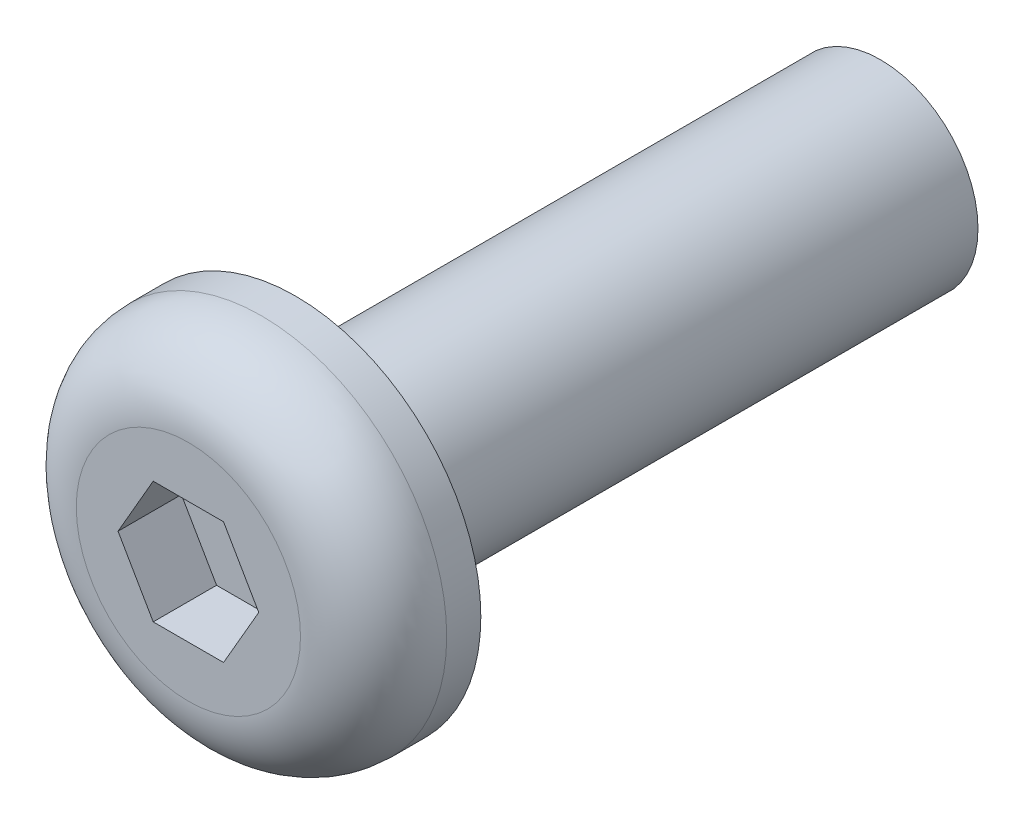
ISO-10303-21;
HEADER;
FILE_DESCRIPTION(('STEP AP214'),'2;1');
FILE_NAME('part.step','',(''),(''),'','','');
FILE_SCHEMA(('AUTOMOTIVE_DESIGN { 1 0 10303 214 1 1 1 1 }'));
ENDSEC;
DATA;
#1=APPLICATION_CONTEXT('core data for automotive mechanical design processes');
#2=APPLICATION_PROTOCOL_DEFINITION('international standard','automotive_design',2000,#1);
#3=PRODUCT_CONTEXT('',#1,'mechanical');
#4=PRODUCT('Part','Part','',(#3));
#5=PRODUCT_RELATED_PRODUCT_CATEGORY('part','',(#4));
#6=PRODUCT_DEFINITION_FORMATION('','',#4);
#7=PRODUCT_DEFINITION_CONTEXT('part definition',#1,'design');
#8=PRODUCT_DEFINITION('design','',#6,#7);
#9=PRODUCT_DEFINITION_SHAPE('','',#8);
#10=(LENGTH_UNIT() NAMED_UNIT(*) SI_UNIT(.MILLI.,.METRE.));
#11=(NAMED_UNIT(*) PLANE_ANGLE_UNIT() SI_UNIT($,.RADIAN.));
#12=(NAMED_UNIT(*) SI_UNIT($,.STERADIAN.) SOLID_ANGLE_UNIT());
#13=UNCERTAINTY_MEASURE_WITH_UNIT(LENGTH_MEASURE(1.E-05),#10,'distance_accuracy_value','');
#14=(GEOMETRIC_REPRESENTATION_CONTEXT(3) GLOBAL_UNCERTAINTY_ASSIGNED_CONTEXT((#13)) GLOBAL_UNIT_ASSIGNED_CONTEXT((#10,
#11,#12)) REPRESENTATION_CONTEXT('',''));
#15=CARTESIAN_POINT('',(0.,0.,0.));
#16=DIRECTION('',(0.,0.,1.));
#17=DIRECTION('',(1.,0.,0.));
#18=AXIS2_PLACEMENT_3D('',#15,#16,#17);
#19=CARTESIAN_POINT('',(0.,0.,14.2));
#20=DIRECTION('',(0.,0.,1.));
#21=DIRECTION('',(1.,0.,0.));
#22=AXIS2_PLACEMENT_3D('',#19,#20,#21);
#23=PLANE('',#22);
#24=CARTESIAN_POINT('',(0.,0.,14.2));
#25=DIRECTION('',(0.,0.,1.));
#26=DIRECTION('',(1.,0.,0.));
#27=AXIS2_PLACEMENT_3D('',#24,#25,#26);
#28=CIRCLE('',#27,2.3);
#29=CARTESIAN_POINT('',(2.3,0.,14.2));
#30=VERTEX_POINT('',#29);
#31=EDGE_CURVE('E47',#30,#30,#28,.T.);
#32=ORIENTED_EDGE('',*,*,#31,.T.);
#33=EDGE_LOOP('',(#32));
#34=FACE_BOUND('',#33,.T.);
#35=DIRECTION('',(-0.5,0.866025403784439,0.));
#36=VECTOR('',#35,1.);
#37=CARTESIAN_POINT('',(1.44337567297406,0.,14.2));
#38=LINE('',#37,#36);
#39=CARTESIAN_POINT('',(1.44337567297406,0.,14.2));
#40=VERTEX_POINT('',#39);
#41=CARTESIAN_POINT('',(0.721687836487032,1.25,14.2));
#42=VERTEX_POINT('',#41);
#43=EDGE_CURVE('E114',#40,#42,#38,.T.);
#44=ORIENTED_EDGE('',*,*,#43,.F.);
#45=DIRECTION('',(0.5,0.866025403784438,0.));
#46=VECTOR('',#45,1.);
#47=CARTESIAN_POINT('',(0.721687836487031,-1.25,14.2));
#48=LINE('',#47,#46);
#49=CARTESIAN_POINT('',(0.721687836487031,-1.25,14.2));
#50=VERTEX_POINT('',#49);
#51=EDGE_CURVE('E93',#50,#40,#48,.T.);
#52=ORIENTED_EDGE('',*,*,#51,.F.);
#53=DIRECTION('',(1.,0.,0.));
#54=VECTOR('',#53,1.);
#55=CARTESIAN_POINT('',(-0.721687836487033,-1.25,14.2));
#56=LINE('',#55,#54);
#57=CARTESIAN_POINT('',(-0.721687836487033,-1.25,14.2));
#58=VERTEX_POINT('',#57);
#59=EDGE_CURVE('E60',#58,#50,#56,.T.);
#60=ORIENTED_EDGE('',*,*,#59,.F.);
#61=DIRECTION('',(0.5,-0.866025403784439,0.));
#62=VECTOR('',#61,1.);
#63=CARTESIAN_POINT('',(-1.44337567297406,0.,14.2));
#64=LINE('',#63,#62);
#65=CARTESIAN_POINT('',(-1.44337567297406,0.,14.2));
#66=VERTEX_POINT('',#65);
#67=EDGE_CURVE('E124',#66,#58,#64,.T.);
#68=ORIENTED_EDGE('',*,*,#67,.F.);
#69=DIRECTION('',(-0.5,-0.866025403784439,0.));
#70=VECTOR('',#69,1.);
#71=CARTESIAN_POINT('',(-0.721687836487032,1.25,14.2));
#72=LINE('',#71,#70);
#73=CARTESIAN_POINT('',(-0.721687836487032,1.25,14.2));
#74=VERTEX_POINT('',#73);
#75=EDGE_CURVE('E113',#74,#66,#72,.T.);
#76=ORIENTED_EDGE('',*,*,#75,.F.);
#77=DIRECTION('',(-1.,0.,0.));
#78=VECTOR('',#77,1.);
#79=CARTESIAN_POINT('',(0.721687836487032,1.25,14.2));
#80=LINE('',#79,#78);
#81=EDGE_CURVE('E102',#42,#74,#80,.T.);
#82=ORIENTED_EDGE('',*,*,#81,.F.);
#83=EDGE_LOOP('',(#44,#52,#60,#68,#76,#82));
#84=FACE_BOUND('',#83,.T.);
#85=ADVANCED_FACE('F39',(#34,#84),#23,.T.);
#86=CARTESIAN_POINT('',(0.,0.,12.));
#87=DIRECTION('',(0.,0.,-1.));
#88=DIRECTION('',(-1.,0.,0.));
#89=AXIS2_PLACEMENT_3D('',#86,#87,#88);
#90=CYLINDRICAL_SURFACE('',#89,2.);
#91=CARTESIAN_POINT('',(0.,0.,12.));
#92=DIRECTION('',(0.,0.,1.));
#93=DIRECTION('',(1.,0.,0.));
#94=AXIS2_PLACEMENT_3D('',#91,#92,#93);
#95=CIRCLE('',#94,2.);
#96=CARTESIAN_POINT('',(2.,0.,12.));
#97=VERTEX_POINT('',#96);
#98=EDGE_CURVE('E151',#97,#97,#95,.T.);
#99=ORIENTED_EDGE('',*,*,#98,.F.);
#100=EDGE_LOOP('',(#99));
#101=FACE_BOUND('',#100,.T.);
#102=CARTESIAN_POINT('',(0.,0.,0.));
#103=DIRECTION('',(0.,0.,1.));
#104=DIRECTION('',(1.,0.,0.));
#105=AXIS2_PLACEMENT_3D('',#102,#103,#104);
#106=CIRCLE('',#105,2.);
#107=CARTESIAN_POINT('',(2.,0.,0.));
#108=VERTEX_POINT('',#107);
#109=EDGE_CURVE('E150',#108,#108,#106,.T.);
#110=ORIENTED_EDGE('',*,*,#109,.T.);
#111=EDGE_LOOP('',(#110));
#112=FACE_BOUND('',#111,.T.);
#113=ADVANCED_FACE('F175',(#101,#112),#90,.T.);
#114=CARTESIAN_POINT('',(0.,0.,0.));
#115=DIRECTION('',(0.,0.,1.));
#116=DIRECTION('',(1.,0.,0.));
#117=AXIS2_PLACEMENT_3D('',#114,#115,#116);
#118=PLANE('',#117);
#119=ORIENTED_EDGE('',*,*,#109,.F.);
#120=EDGE_LOOP('',(#119));
#121=FACE_BOUND('',#120,.T.);
#122=ADVANCED_FACE('F180',(#121),#118,.F.);
#123=CARTESIAN_POINT('',(0.,0.,14.2));
#124=DIRECTION('',(0.,0.,-1.));
#125=DIRECTION('',(-1.,0.,0.));
#126=AXIS2_PLACEMENT_3D('',#123,#124,#125);
#127=CYLINDRICAL_SURFACE('',#126,3.8);
#128=CARTESIAN_POINT('',(0.,0.,12.7));
#129=DIRECTION('',(0.,0.,1.));
#130=DIRECTION('',(1.,0.,0.));
#131=AXIS2_PLACEMENT_3D('',#128,#129,#130);
#132=CIRCLE('',#131,3.8);
#133=CARTESIAN_POINT('',(3.8,0.,12.7));
#134=VERTEX_POINT('',#133);
#135=EDGE_CURVE('E11',#134,#134,#132,.F.);
#136=ORIENTED_EDGE('',*,*,#135,.T.);
#137=EDGE_LOOP('',(#136));
#138=FACE_BOUND('',#137,.T.);
#139=CARTESIAN_POINT('',(0.,0.,12.));
#140=DIRECTION('',(0.,0.,1.));
#141=DIRECTION('',(1.,0.,0.));
#142=AXIS2_PLACEMENT_3D('',#139,#140,#141);
#143=CIRCLE('',#142,3.8);
#144=CARTESIAN_POINT('',(3.8,0.,12.));
#145=VERTEX_POINT('',#144);
#146=EDGE_CURVE('E147',#145,#145,#143,.T.);
#147=ORIENTED_EDGE('',*,*,#146,.T.);
#148=EDGE_LOOP('',(#147));
#149=FACE_BOUND('',#148,.T.);
#150=ADVANCED_FACE('F171',(#138,#149),#127,.T.);
#151=CARTESIAN_POINT('',(0.,0.,12.));
#152=DIRECTION('',(0.,0.,1.));
#153=DIRECTION('',(1.,0.,0.));
#154=AXIS2_PLACEMENT_3D('',#151,#152,#153);
#155=PLANE('',#154);
#156=ORIENTED_EDGE('',*,*,#98,.T.);
#157=EDGE_LOOP('',(#156));
#158=FACE_BOUND('',#157,.T.);
#159=ORIENTED_EDGE('',*,*,#146,.F.);
#160=EDGE_LOOP('',(#159));
#161=FACE_BOUND('',#160,.T.);
#162=ADVANCED_FACE('F161',(#158,#161),#155,.F.);
#163=CARTESIAN_POINT('',(0.,0.,12.7));
#164=DIRECTION('',(0.,0.,1.));
#165=DIRECTION('',(1.,0.,0.));
#166=AXIS2_PLACEMENT_3D('',#163,#164,#165);
#167=TOROIDAL_SURFACE('',#166,2.3,1.5);
#168=ORIENTED_EDGE('',*,*,#135,.F.);
#169=EDGE_LOOP('',(#168));
#170=FACE_BOUND('',#169,.T.);
#171=ORIENTED_EDGE('',*,*,#31,.F.);
#172=EDGE_LOOP('',(#171));
#173=FACE_BOUND('',#172,.T.);
#174=ADVANCED_FACE('F41',(#170,#173),#167,.T.);
#175=CARTESIAN_POINT('',(0.721687836487031,-1.25,14.2));
#176=DIRECTION('',(-0.866025403784438,0.5,0.));
#177=DIRECTION('',(-0.5,-0.866025403784438,0.));
#178=AXIS2_PLACEMENT_3D('',#175,#176,#177);
#179=PLANE('',#178);
#180=DIRECTION('',(0.5,0.866025403784438,0.));
#181=VECTOR('',#180,1.);
#182=CARTESIAN_POINT('',(0.721687836487031,-1.25,12.9));
#183=LINE('',#182,#181);
#184=CARTESIAN_POINT('',(0.721687836487031,-1.25,12.9));
#185=VERTEX_POINT('',#184);
#186=CARTESIAN_POINT('',(1.44337567297406,0.,12.9));
#187=VERTEX_POINT('',#186);
#188=EDGE_CURVE('E131',#185,#187,#183,.T.);
#189=ORIENTED_EDGE('',*,*,#188,.F.);
#190=DIRECTION('',(0.,0.,-1.));
#191=VECTOR('',#190,1.);
#192=CARTESIAN_POINT('',(0.721687836487031,-1.25,14.2));
#193=LINE('',#192,#191);
#194=EDGE_CURVE('E130',#50,#185,#193,.T.);
#195=ORIENTED_EDGE('',*,*,#194,.F.);
#196=ORIENTED_EDGE('',*,*,#51,.T.);
#197=DIRECTION('',(0.,0.,-1.));
#198=VECTOR('',#197,1.);
#199=CARTESIAN_POINT('',(1.44337567297406,0.,14.2));
#200=LINE('',#199,#198);
#201=EDGE_CURVE('E145',#40,#187,#200,.T.);
#202=ORIENTED_EDGE('',*,*,#201,.T.);
#203=EDGE_LOOP('',(#189,#195,#196,#202));
#204=FACE_BOUND('',#203,.T.);
#205=ADVANCED_FACE('F160',(#204),#179,.T.);
#206=CARTESIAN_POINT('',(1.44337567297406,0.,14.2));
#207=DIRECTION('',(-0.866025403784439,-0.5,0.));
#208=DIRECTION('',(0.5,-0.866025403784439,0.));
#209=AXIS2_PLACEMENT_3D('',#206,#207,#208);
#210=PLANE('',#209);
#211=DIRECTION('',(-0.5,0.866025403784439,0.));
#212=VECTOR('',#211,1.);
#213=CARTESIAN_POINT('',(1.44337567297406,0.,12.9));
#214=LINE('',#213,#212);
#215=CARTESIAN_POINT('',(0.721687836487032,1.25,12.9));
#216=VERTEX_POINT('',#215);
#217=EDGE_CURVE('E133',#187,#216,#214,.T.);
#218=ORIENTED_EDGE('',*,*,#217,.F.);
#219=ORIENTED_EDGE('',*,*,#201,.F.);
#220=ORIENTED_EDGE('',*,*,#43,.T.);
#221=DIRECTION('',(0.,0.,-1.));
#222=VECTOR('',#221,1.);
#223=CARTESIAN_POINT('',(0.721687836487032,1.25,14.2));
#224=LINE('',#223,#222);
#225=EDGE_CURVE('E109',#42,#216,#224,.T.);
#226=ORIENTED_EDGE('',*,*,#225,.T.);
#227=EDGE_LOOP('',(#218,#219,#220,#226));
#228=FACE_BOUND('',#227,.T.);
#229=ADVANCED_FACE('F168',(#228),#210,.T.);
#230=CARTESIAN_POINT('',(0.721687836487032,1.25,14.2));
#231=DIRECTION('',(0.,-1.,0.));
#232=DIRECTION('',(1.,0.,0.));
#233=AXIS2_PLACEMENT_3D('',#230,#231,#232);
#234=PLANE('',#233);
#235=DIRECTION('',(-1.,0.,0.));
#236=VECTOR('',#235,1.);
#237=CARTESIAN_POINT('',(0.721687836487032,1.25,12.9));
#238=LINE('',#237,#236);
#239=CARTESIAN_POINT('',(-0.721687836487032,1.25,12.9));
#240=VERTEX_POINT('',#239);
#241=EDGE_CURVE('E135',#216,#240,#238,.T.);
#242=ORIENTED_EDGE('',*,*,#241,.F.);
#243=ORIENTED_EDGE('',*,*,#225,.F.);
#244=ORIENTED_EDGE('',*,*,#81,.T.);
#245=DIRECTION('',(0.,0.,-1.));
#246=VECTOR('',#245,1.);
#247=CARTESIAN_POINT('',(-0.721687836487032,1.25,14.2));
#248=LINE('',#247,#246);
#249=EDGE_CURVE('E106',#74,#240,#248,.T.);
#250=ORIENTED_EDGE('',*,*,#249,.T.);
#251=EDGE_LOOP('',(#242,#243,#244,#250));
#252=FACE_BOUND('',#251,.T.);
#253=ADVANCED_FACE('F105',(#252),#234,.T.);
#254=CARTESIAN_POINT('',(-0.721687836487032,1.25,14.2));
#255=DIRECTION('',(0.866025403784439,-0.5,0.));
#256=DIRECTION('',(0.5,0.866025403784439,0.));
#257=AXIS2_PLACEMENT_3D('',#254,#255,#256);
#258=PLANE('',#257);
#259=DIRECTION('',(-0.5,-0.866025403784439,0.));
#260=VECTOR('',#259,1.);
#261=CARTESIAN_POINT('',(-0.721687836487032,1.25,12.9));
#262=LINE('',#261,#260);
#263=CARTESIAN_POINT('',(-1.44337567297406,0.,12.9));
#264=VERTEX_POINT('',#263);
#265=EDGE_CURVE('E120',#240,#264,#262,.T.);
#266=ORIENTED_EDGE('',*,*,#265,.F.);
#267=ORIENTED_EDGE('',*,*,#249,.F.);
#268=ORIENTED_EDGE('',*,*,#75,.T.);
#269=DIRECTION('',(0.,0.,-1.));
#270=VECTOR('',#269,1.);
#271=CARTESIAN_POINT('',(-1.44337567297406,0.,14.2));
#272=LINE('',#271,#270);
#273=EDGE_CURVE('E121',#66,#264,#272,.T.);
#274=ORIENTED_EDGE('',*,*,#273,.T.);
#275=EDGE_LOOP('',(#266,#267,#268,#274));
#276=FACE_BOUND('',#275,.T.);
#277=ADVANCED_FACE('F117',(#276),#258,.T.);
#278=CARTESIAN_POINT('',(-1.44337567297406,0.,14.2));
#279=DIRECTION('',(0.866025403784439,0.5,0.));
#280=DIRECTION('',(-0.5,0.866025403784439,0.));
#281=AXIS2_PLACEMENT_3D('',#278,#279,#280);
#282=PLANE('',#281);
#283=DIRECTION('',(0.5,-0.866025403784439,0.));
#284=VECTOR('',#283,1.);
#285=CARTESIAN_POINT('',(-1.44337567297406,0.,12.9));
#286=LINE('',#285,#284);
#287=CARTESIAN_POINT('',(-0.721687836487033,-1.25,12.9));
#288=VERTEX_POINT('',#287);
#289=EDGE_CURVE('E138',#264,#288,#286,.T.);
#290=ORIENTED_EDGE('',*,*,#289,.F.);
#291=ORIENTED_EDGE('',*,*,#273,.F.);
#292=ORIENTED_EDGE('',*,*,#67,.T.);
#293=DIRECTION('',(0.,0.,-1.));
#294=VECTOR('',#293,1.);
#295=CARTESIAN_POINT('',(-0.721687836487033,-1.25,14.2));
#296=LINE('',#295,#294);
#297=EDGE_CURVE('E54',#58,#288,#296,.T.);
#298=ORIENTED_EDGE('',*,*,#297,.T.);
#299=EDGE_LOOP('',(#290,#291,#292,#298));
#300=FACE_BOUND('',#299,.T.);
#301=ADVANCED_FACE('F243',(#300),#282,.T.);
#302=CARTESIAN_POINT('',(-0.721687836487033,-1.25,14.2));
#303=DIRECTION('',(0.,1.,0.));
#304=DIRECTION('',(-1.,0.,0.));
#305=AXIS2_PLACEMENT_3D('',#302,#303,#304);
#306=PLANE('',#305);
#307=DIRECTION('',(1.,0.,0.));
#308=VECTOR('',#307,1.);
#309=CARTESIAN_POINT('',(-0.721687836487033,-1.25,12.9));
#310=LINE('',#309,#308);
#311=EDGE_CURVE('E86',#288,#185,#310,.T.);
#312=ORIENTED_EDGE('',*,*,#311,.F.);
#313=ORIENTED_EDGE('',*,*,#297,.F.);
#314=ORIENTED_EDGE('',*,*,#59,.T.);
#315=ORIENTED_EDGE('',*,*,#194,.T.);
#316=EDGE_LOOP('',(#312,#313,#314,#315));
#317=FACE_BOUND('',#316,.T.);
#318=ADVANCED_FACE('F251',(#317),#306,.T.);
#319=CARTESIAN_POINT('',(0.,0.,12.9));
#320=DIRECTION('',(0.,0.,1.));
#321=DIRECTION('',(1.,0.,0.));
#322=AXIS2_PLACEMENT_3D('',#319,#320,#321);
#323=PLANE('',#322);
#324=ORIENTED_EDGE('',*,*,#188,.T.);
#325=ORIENTED_EDGE('',*,*,#217,.T.);
#326=ORIENTED_EDGE('',*,*,#241,.T.);
#327=ORIENTED_EDGE('',*,*,#265,.T.);
#328=ORIENTED_EDGE('',*,*,#289,.T.);
#329=ORIENTED_EDGE('',*,*,#311,.T.);
#330=EDGE_LOOP('',(#324,#325,#326,#327,#328,#329));
#331=FACE_BOUND('',#330,.T.);
#332=ADVANCED_FACE('F260',(#331),#323,.T.);
#333=CLOSED_SHELL('',(#85,#113,#122,#150,#162,#174,#205,#229,#253,#277,#301,#318,#332));
#334=MANIFOLD_SOLID_BREP('B2',#333);
#335=ADVANCED_BREP_SHAPE_REPRESENTATION('',(#18,#334),#14);
#336=SHAPE_DEFINITION_REPRESENTATION(#9,#335);
ENDSEC;
END-ISO-10303-21;
